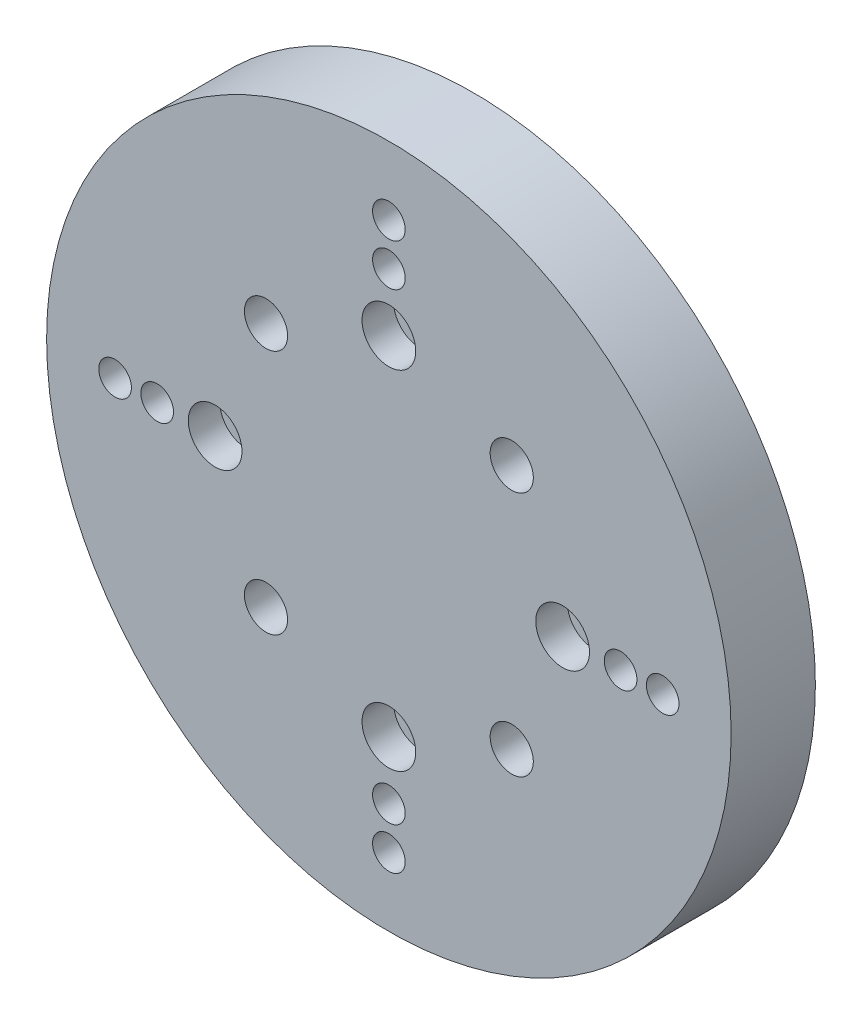
ISO-10303-21;
HEADER;
FILE_DESCRIPTION(('STEP AP214'),'2;1');
FILE_NAME('part.step','',(''),(''),'','','');
FILE_SCHEMA(('AUTOMOTIVE_DESIGN { 1 0 10303 214 1 1 1 1 }'));
ENDSEC;
DATA;
#1=APPLICATION_CONTEXT('core data for automotive mechanical design processes');
#2=APPLICATION_PROTOCOL_DEFINITION('international standard','automotive_design',2000,#1);
#3=PRODUCT_CONTEXT('',#1,'mechanical');
#4=PRODUCT('Part','Part','',(#3));
#5=PRODUCT_RELATED_PRODUCT_CATEGORY('part','',(#4));
#6=PRODUCT_DEFINITION_FORMATION('','',#4);
#7=PRODUCT_DEFINITION_CONTEXT('part definition',#1,'design');
#8=PRODUCT_DEFINITION('design','',#6,#7);
#9=PRODUCT_DEFINITION_SHAPE('','',#8);
#10=(LENGTH_UNIT() NAMED_UNIT(*) SI_UNIT(.MILLI.,.METRE.));
#11=(NAMED_UNIT(*) PLANE_ANGLE_UNIT() SI_UNIT($,.RADIAN.));
#12=(NAMED_UNIT(*) SI_UNIT($,.STERADIAN.) SOLID_ANGLE_UNIT());
#13=UNCERTAINTY_MEASURE_WITH_UNIT(LENGTH_MEASURE(1.E-05),#10,'distance_accuracy_value','');
#14=(GEOMETRIC_REPRESENTATION_CONTEXT(3) GLOBAL_UNCERTAINTY_ASSIGNED_CONTEXT((#13)) GLOBAL_UNIT_ASSIGNED_CONTEXT((#10,
#11,#12)) REPRESENTATION_CONTEXT('',''));
#15=CARTESIAN_POINT('',(0.,0.,0.));
#16=DIRECTION('',(0.,0.,1.));
#17=DIRECTION('',(1.,0.,0.));
#18=AXIS2_PLACEMENT_3D('',#15,#16,#17);
#19=CARTESIAN_POINT('',(0.,0.,34.));
#20=DIRECTION('',(0.,0.,-1.));
#21=DIRECTION('',(-1.,0.,0.));
#22=AXIS2_PLACEMENT_3D('',#19,#20,#21);
#23=CYLINDRICAL_SURFACE('',#22,32.5);
#24=CARTESIAN_POINT('',(0.,0.,34.));
#25=DIRECTION('',(0.,0.,1.));
#26=DIRECTION('',(1.,0.,0.));
#27=AXIS2_PLACEMENT_3D('',#24,#25,#26);
#28=CIRCLE('',#27,32.5);
#29=CARTESIAN_POINT('',(32.5,0.,34.));
#30=VERTEX_POINT('',#29);
#31=EDGE_CURVE('E10',#30,#30,#28,.T.);
#32=ORIENTED_EDGE('',*,*,#31,.F.);
#33=EDGE_LOOP('',(#32));
#34=FACE_BOUND('',#33,.T.);
#35=CARTESIAN_POINT('',(0.,0.,26.));
#36=DIRECTION('',(0.,0.,1.));
#37=DIRECTION('',(1.,0.,0.));
#38=AXIS2_PLACEMENT_3D('',#35,#36,#37);
#39=CIRCLE('',#38,32.5);
#40=CARTESIAN_POINT('',(32.5,0.,26.));
#41=VERTEX_POINT('',#40);
#42=EDGE_CURVE('E129',#41,#41,#39,.T.);
#43=ORIENTED_EDGE('',*,*,#42,.T.);
#44=EDGE_LOOP('',(#43));
#45=FACE_BOUND('',#44,.T.);
#46=ADVANCED_FACE('F36',(#34,#45),#23,.T.);
#47=CARTESIAN_POINT('',(0.,0.,34.));
#48=DIRECTION('',(0.,0.,1.));
#49=DIRECTION('',(1.,0.,0.));
#50=AXIS2_PLACEMENT_3D('',#47,#48,#49);
#51=PLANE('',#50);
#52=CARTESIAN_POINT('',(11.6672618895781,11.667261889578,34.));
#53=DIRECTION('',(0.,0.,1.));
#54=DIRECTION('',(1.,0.,0.));
#55=AXIS2_PLACEMENT_3D('',#52,#53,#54);
#56=CIRCLE('',#55,2.05);
#57=CARTESIAN_POINT('',(13.7172618895781,11.667261889578,34.));
#58=VERTEX_POINT('',#57);
#59=EDGE_CURVE('E77',#58,#58,#56,.T.);
#60=ORIENTED_EDGE('',*,*,#59,.F.);
#61=EDGE_LOOP('',(#60));
#62=FACE_BOUND('',#61,.T.);
#63=CARTESIAN_POINT('',(11.6672618895779,-11.6672618895781,34.));
#64=DIRECTION('',(0.,0.,1.));
#65=DIRECTION('',(1.,0.,0.));
#66=AXIS2_PLACEMENT_3D('',#63,#64,#65);
#67=CIRCLE('',#66,2.05);
#68=CARTESIAN_POINT('',(13.7172618895779,-11.6672618895781,34.));
#69=VERTEX_POINT('',#68);
#70=EDGE_CURVE('E84',#69,#69,#67,.T.);
#71=ORIENTED_EDGE('',*,*,#70,.F.);
#72=EDGE_LOOP('',(#71));
#73=FACE_BOUND('',#72,.T.);
#74=CARTESIAN_POINT('',(-11.6672618895757,-11.667261889578,33.9999999999978));
#75=DIRECTION('',(0.,0.,1.));
#76=DIRECTION('',(1.,0.,0.));
#77=AXIS2_PLACEMENT_3D('',#74,#75,#76);
#78=CIRCLE('',#77,2.05000000000018);
#79=CARTESIAN_POINT('',(-9.6172618895755,-11.667261889578,33.9999999999978));
#80=VERTEX_POINT('',#79);
#81=EDGE_CURVE('E90',#80,#80,#78,.T.);
#82=ORIENTED_EDGE('',*,*,#81,.F.);
#83=EDGE_LOOP('',(#82));
#84=FACE_BOUND('',#83,.T.);
#85=CARTESIAN_POINT('',(0.,22.,34.));
#86=DIRECTION('',(0.,0.,1.));
#87=DIRECTION('',(1.,0.,0.));
#88=AXIS2_PLACEMENT_3D('',#85,#86,#87);
#89=CIRCLE('',#88,1.55);
#90=CARTESIAN_POINT('',(1.55,22.,34.));
#91=VERTEX_POINT('',#90);
#92=EDGE_CURVE('E96',#91,#91,#89,.T.);
#93=ORIENTED_EDGE('',*,*,#92,.F.);
#94=EDGE_LOOP('',(#93));
#95=FACE_BOUND('',#94,.T.);
#96=CARTESIAN_POINT('',(0.,26.,34.));
#97=DIRECTION('',(0.,0.,1.));
#98=DIRECTION('',(1.,0.,0.));
#99=AXIS2_PLACEMENT_3D('',#96,#97,#98);
#100=CIRCLE('',#99,1.55);
#101=CARTESIAN_POINT('',(1.55,26.,34.));
#102=VERTEX_POINT('',#101);
#103=EDGE_CURVE('E53',#102,#102,#100,.T.);
#104=ORIENTED_EDGE('',*,*,#103,.F.);
#105=EDGE_LOOP('',(#104));
#106=FACE_BOUND('',#105,.T.);
#107=CARTESIAN_POINT('',(0.,16.5,34.));
#108=DIRECTION('',(0.,0.,1.));
#109=DIRECTION('',(1.,0.,0.));
#110=AXIS2_PLACEMENT_3D('',#107,#108,#109);
#111=CIRCLE('',#110,2.55);
#112=CARTESIAN_POINT('',(2.55,16.5,34.));
#113=VERTEX_POINT('',#112);
#114=EDGE_CURVE('E60',#113,#113,#111,.T.);
#115=ORIENTED_EDGE('',*,*,#114,.F.);
#116=EDGE_LOOP('',(#115));
#117=FACE_BOUND('',#116,.T.);
#118=CARTESIAN_POINT('',(16.500000000008,0.,33.9999999999921));
#119=DIRECTION('',(0.,0.,1.));
#120=DIRECTION('',(1.,0.,0.));
#121=AXIS2_PLACEMENT_3D('',#118,#119,#120);
#122=CIRCLE('',#121,2.55000000000006);
#123=CARTESIAN_POINT('',(19.050000000008,0.,33.9999999999921));
#124=VERTEX_POINT('',#123);
#125=EDGE_CURVE('E66',#124,#124,#122,.T.);
#126=ORIENTED_EDGE('',*,*,#125,.F.);
#127=EDGE_LOOP('',(#126));
#128=FACE_BOUND('',#127,.T.);
#129=CARTESIAN_POINT('',(0.,-16.5,34.));
#130=DIRECTION('',(0.,0.,1.));
#131=DIRECTION('',(1.,0.,0.));
#132=AXIS2_PLACEMENT_3D('',#129,#130,#131);
#133=CIRCLE('',#132,2.55000000000012);
#134=CARTESIAN_POINT('',(2.55000000000012,-16.5,34.));
#135=VERTEX_POINT('',#134);
#136=EDGE_CURVE('E72',#135,#135,#133,.T.);
#137=ORIENTED_EDGE('',*,*,#136,.F.);
#138=EDGE_LOOP('',(#137));
#139=FACE_BOUND('',#138,.T.);
#140=CARTESIAN_POINT('',(26.0000000000079,0.,33.9999999999923));
#141=DIRECTION('',(0.,0.,1.));
#142=DIRECTION('',(1.,0.,0.));
#143=AXIS2_PLACEMENT_3D('',#140,#141,#142);
#144=CIRCLE('',#143,1.55000000000009);
#145=CARTESIAN_POINT('',(27.550000000008,0.,33.9999999999923));
#146=VERTEX_POINT('',#145);
#147=EDGE_CURVE('E125',#146,#146,#144,.T.);
#148=ORIENTED_EDGE('',*,*,#147,.F.);
#149=EDGE_LOOP('',(#148));
#150=FACE_BOUND('',#149,.T.);
#151=CARTESIAN_POINT('',(22.0000000000079,0.,33.9999999999923));
#152=DIRECTION('',(0.,0.,1.));
#153=DIRECTION('',(1.,0.,0.));
#154=AXIS2_PLACEMENT_3D('',#151,#152,#153);
#155=CIRCLE('',#154,1.55000000000008);
#156=CARTESIAN_POINT('',(23.550000000008,0.,33.9999999999923));
#157=VERTEX_POINT('',#156);
#158=EDGE_CURVE('E132',#157,#157,#155,.T.);
#159=ORIENTED_EDGE('',*,*,#158,.F.);
#160=EDGE_LOOP('',(#159));
#161=FACE_BOUND('',#160,.T.);
#162=CARTESIAN_POINT('',(0.,-26.,34.));
#163=DIRECTION('',(0.,0.,1.));
#164=DIRECTION('',(1.,0.,0.));
#165=AXIS2_PLACEMENT_3D('',#162,#163,#164);
#166=CIRCLE('',#165,1.55000000000018);
#167=CARTESIAN_POINT('',(1.55000000000018,-26.,34.));
#168=VERTEX_POINT('',#167);
#169=EDGE_CURVE('E138',#168,#168,#166,.T.);
#170=ORIENTED_EDGE('',*,*,#169,.F.);
#171=EDGE_LOOP('',(#170));
#172=FACE_BOUND('',#171,.T.);
#173=CARTESIAN_POINT('',(-11.6672618895777,11.6672618895781,33.9999999999998));
#174=DIRECTION('',(0.,0.,1.));
#175=DIRECTION('',(1.,0.,0.));
#176=AXIS2_PLACEMENT_3D('',#173,#174,#175);
#177=CIRCLE('',#176,2.05);
#178=CARTESIAN_POINT('',(-9.61726188957767,11.6672618895781,33.9999999999998));
#179=VERTEX_POINT('',#178);
#180=EDGE_CURVE('E108',#179,#179,#177,.T.);
#181=ORIENTED_EDGE('',*,*,#180,.F.);
#182=EDGE_LOOP('',(#181));
#183=FACE_BOUND('',#182,.T.);
#184=CARTESIAN_POINT('',(-22.,0.,34.));
#185=DIRECTION('',(0.,0.,1.));
#186=DIRECTION('',(1.,0.,0.));
#187=AXIS2_PLACEMENT_3D('',#184,#185,#186);
#188=CIRCLE('',#187,1.55000000000022);
#189=CARTESIAN_POINT('',(-20.4499999999998,0.,34.));
#190=VERTEX_POINT('',#189);
#191=EDGE_CURVE('E101',#190,#190,#188,.T.);
#192=ORIENTED_EDGE('',*,*,#191,.F.);
#193=EDGE_LOOP('',(#192));
#194=FACE_BOUND('',#193,.T.);
#195=CARTESIAN_POINT('',(-26.,0.,34.));
#196=DIRECTION('',(0.,0.,1.));
#197=DIRECTION('',(1.,0.,0.));
#198=AXIS2_PLACEMENT_3D('',#195,#196,#197);
#199=CIRCLE('',#198,1.55000000000026);
#200=CARTESIAN_POINT('',(-24.4499999999998,0.,34.));
#201=VERTEX_POINT('',#200);
#202=EDGE_CURVE('E120',#201,#201,#199,.T.);
#203=ORIENTED_EDGE('',*,*,#202,.F.);
#204=EDGE_LOOP('',(#203));
#205=FACE_BOUND('',#204,.T.);
#206=CARTESIAN_POINT('',(0.,-22.,34.));
#207=DIRECTION('',(0.,0.,1.));
#208=DIRECTION('',(1.,0.,0.));
#209=AXIS2_PLACEMENT_3D('',#206,#207,#208);
#210=CIRCLE('',#209,1.55000000000015);
#211=CARTESIAN_POINT('',(1.55000000000015,-22.,34.));
#212=VERTEX_POINT('',#211);
#213=EDGE_CURVE('E113',#212,#212,#210,.T.);
#214=ORIENTED_EDGE('',*,*,#213,.F.);
#215=EDGE_LOOP('',(#214));
#216=FACE_BOUND('',#215,.T.);
#217=CARTESIAN_POINT('',(-16.5,0.,34.));
#218=DIRECTION('',(0.,0.,1.));
#219=DIRECTION('',(1.,0.,0.));
#220=AXIS2_PLACEMENT_3D('',#217,#218,#219);
#221=CIRCLE('',#220,2.55000000000017);
#222=CARTESIAN_POINT('',(-13.9499999999998,0.,34.));
#223=VERTEX_POINT('',#222);
#224=EDGE_CURVE('E46',#223,#223,#221,.T.);
#225=ORIENTED_EDGE('',*,*,#224,.F.);
#226=EDGE_LOOP('',(#225));
#227=FACE_BOUND('',#226,.T.);
#228=ORIENTED_EDGE('',*,*,#31,.T.);
#229=EDGE_LOOP('',(#228));
#230=FACE_BOUND('',#229,.T.);
#231=ADVANCED_FACE('F168',(#62,#73,#84,#95,#106,#117,#128,#139,#150,#161,#172,#183,#194,#205,
#216,#227,#230),#51,.T.);
#232=CARTESIAN_POINT('',(-16.4999999999998,0.,31.));
#233=DIRECTION('',(0.,0.,1.));
#234=DIRECTION('',(1.,0.,0.));
#235=AXIS2_PLACEMENT_3D('',#232,#233,#234);
#236=CYLINDRICAL_SURFACE('',#235,2.55000000000017);
#237=CARTESIAN_POINT('',(-16.4999999999998,0.,31.));
#238=DIRECTION('',(0.,0.,1.));
#239=DIRECTION('',(1.,0.,0.));
#240=AXIS2_PLACEMENT_3D('',#237,#238,#239);
#241=CIRCLE('',#240,2.55000000000017);
#242=CARTESIAN_POINT('',(-13.9499999999997,0.,31.));
#243=VERTEX_POINT('',#242);
#244=EDGE_CURVE('E42',#243,#243,#241,.T.);
#245=ORIENTED_EDGE('',*,*,#244,.F.);
#246=EDGE_LOOP('',(#245));
#247=FACE_BOUND('',#246,.T.);
#248=ORIENTED_EDGE('',*,*,#224,.T.);
#249=EDGE_LOOP('',(#248));
#250=FACE_BOUND('',#249,.T.);
#251=ADVANCED_FACE('F173',(#247,#250),#236,.F.);
#252=CARTESIAN_POINT('',(-16.4999999999998,0.,31.));
#253=DIRECTION('',(0.,0.,1.));
#254=DIRECTION('',(1.,0.,0.));
#255=AXIS2_PLACEMENT_3D('',#252,#253,#254);
#256=PLANE('',#255);
#257=ORIENTED_EDGE('',*,*,#244,.T.);
#258=EDGE_LOOP('',(#257));
#259=FACE_BOUND('',#258,.T.);
#260=ADVANCED_FACE('F178',(#259),#256,.T.);
#261=CARTESIAN_POINT('',(1.22124532708767E-12,-22.,30.9999999999987));
#262=DIRECTION('',(0.,0.,1.));
#263=DIRECTION('',(1.,0.,0.));
#264=AXIS2_PLACEMENT_3D('',#261,#262,#263);
#265=CYLINDRICAL_SURFACE('',#264,1.55000000000015);
#266=CARTESIAN_POINT('',(1.22124532708767E-12,-22.,30.9999999999987));
#267=DIRECTION('',(0.,0.,1.));
#268=DIRECTION('',(1.,0.,0.));
#269=AXIS2_PLACEMENT_3D('',#266,#267,#268);
#270=CIRCLE('',#269,1.55000000000015);
#271=CARTESIAN_POINT('',(1.55000000000137,-22.,30.9999999999987));
#272=VERTEX_POINT('',#271);
#273=EDGE_CURVE('E116',#272,#272,#270,.T.);
#274=ORIENTED_EDGE('',*,*,#273,.F.);
#275=EDGE_LOOP('',(#274));
#276=FACE_BOUND('',#275,.T.);
#277=ORIENTED_EDGE('',*,*,#213,.T.);
#278=EDGE_LOOP('',(#277));
#279=FACE_BOUND('',#278,.T.);
#280=ADVANCED_FACE('F186',(#276,#279),#265,.F.);
#281=CARTESIAN_POINT('',(1.22124532708767E-12,-22.,30.9999999999987));
#282=DIRECTION('',(0.,0.,1.));
#283=DIRECTION('',(1.,0.,0.));
#284=AXIS2_PLACEMENT_3D('',#281,#282,#283);
#285=PLANE('',#284);
#286=ORIENTED_EDGE('',*,*,#273,.T.);
#287=EDGE_LOOP('',(#286));
#288=FACE_BOUND('',#287,.T.);
#289=ADVANCED_FACE('F271',(#288),#285,.T.);
#290=CARTESIAN_POINT('',(-25.9999999999997,0.,31.));
#291=DIRECTION('',(0.,0.,1.));
#292=DIRECTION('',(1.,0.,0.));
#293=AXIS2_PLACEMENT_3D('',#290,#291,#292);
#294=CYLINDRICAL_SURFACE('',#293,1.55000000000026);
#295=CARTESIAN_POINT('',(-25.9999999999997,0.,31.));
#296=DIRECTION('',(0.,0.,1.));
#297=DIRECTION('',(1.,0.,0.));
#298=AXIS2_PLACEMENT_3D('',#295,#296,#297);
#299=CIRCLE('',#298,1.55000000000026);
#300=CARTESIAN_POINT('',(-24.4499999999994,0.,31.));
#301=VERTEX_POINT('',#300);
#302=EDGE_CURVE('E105',#301,#301,#299,.T.);
#303=ORIENTED_EDGE('',*,*,#302,.F.);
#304=EDGE_LOOP('',(#303));
#305=FACE_BOUND('',#304,.T.);
#306=ORIENTED_EDGE('',*,*,#202,.T.);
#307=EDGE_LOOP('',(#306));
#308=FACE_BOUND('',#307,.T.);
#309=ADVANCED_FACE('F275',(#305,#308),#294,.F.);
#310=CARTESIAN_POINT('',(-25.9999999999997,0.,31.));
#311=DIRECTION('',(0.,0.,1.));
#312=DIRECTION('',(1.,0.,0.));
#313=AXIS2_PLACEMENT_3D('',#310,#311,#312);
#314=PLANE('',#313);
#315=ORIENTED_EDGE('',*,*,#302,.T.);
#316=EDGE_LOOP('',(#315));
#317=FACE_BOUND('',#316,.T.);
#318=ADVANCED_FACE('F255',(#317),#314,.T.);
#319=CARTESIAN_POINT('',(-21.9999999999995,0.,30.9999999999998));
#320=DIRECTION('',(0.,0.,1.));
#321=DIRECTION('',(1.,0.,0.));
#322=AXIS2_PLACEMENT_3D('',#319,#320,#321);
#323=CYLINDRICAL_SURFACE('',#322,1.55000000000022);
#324=CARTESIAN_POINT('',(-21.9999999999995,0.,30.9999999999998));
#325=DIRECTION('',(0.,0.,1.));
#326=DIRECTION('',(1.,0.,0.));
#327=AXIS2_PLACEMENT_3D('',#324,#325,#326);
#328=CIRCLE('',#327,1.55000000000022);
#329=CARTESIAN_POINT('',(-20.4499999999992,0.,30.9999999999998));
#330=VERTEX_POINT('',#329);
#331=EDGE_CURVE('E104',#330,#330,#328,.T.);
#332=ORIENTED_EDGE('',*,*,#331,.F.);
#333=EDGE_LOOP('',(#332));
#334=FACE_BOUND('',#333,.T.);
#335=ORIENTED_EDGE('',*,*,#191,.T.);
#336=EDGE_LOOP('',(#335));
#337=FACE_BOUND('',#336,.T.);
#338=ADVANCED_FACE('F251',(#334,#337),#323,.F.);
#339=CARTESIAN_POINT('',(-21.9999999999995,0.,30.9999999999998));
#340=DIRECTION('',(0.,0.,1.));
#341=DIRECTION('',(1.,0.,0.));
#342=AXIS2_PLACEMENT_3D('',#339,#340,#341);
#343=PLANE('',#342);
#344=ORIENTED_EDGE('',*,*,#331,.T.);
#345=EDGE_LOOP('',(#344));
#346=FACE_BOUND('',#345,.T.);
#347=ADVANCED_FACE('F254',(#346),#343,.T.);
#348=CARTESIAN_POINT('',(-11.667261889578,11.6672618895781,31.));
#349=DIRECTION('',(0.,0.,1.));
#350=DIRECTION('',(1.,0.,0.));
#351=AXIS2_PLACEMENT_3D('',#348,#349,#350);
#352=CYLINDRICAL_SURFACE('',#351,2.05);
#353=CARTESIAN_POINT('',(-11.667261889578,11.6672618895781,31.));
#354=DIRECTION('',(0.,0.,1.));
#355=DIRECTION('',(1.,0.,0.));
#356=AXIS2_PLACEMENT_3D('',#353,#354,#355);
#357=CIRCLE('',#356,2.05);
#358=CARTESIAN_POINT('',(-9.61726188957801,11.6672618895781,31.));
#359=VERTEX_POINT('',#358);
#360=EDGE_CURVE('E81',#359,#359,#357,.T.);
#361=ORIENTED_EDGE('',*,*,#360,.F.);
#362=EDGE_LOOP('',(#361));
#363=FACE_BOUND('',#362,.T.);
#364=ORIENTED_EDGE('',*,*,#180,.T.);
#365=EDGE_LOOP('',(#364));
#366=FACE_BOUND('',#365,.T.);
#367=ADVANCED_FACE('F259',(#363,#366),#352,.F.);
#368=CARTESIAN_POINT('',(-11.667261889578,11.6672618895781,31.));
#369=DIRECTION('',(0.,0.,1.));
#370=DIRECTION('',(1.,0.,0.));
#371=AXIS2_PLACEMENT_3D('',#368,#369,#370);
#372=PLANE('',#371);
#373=ORIENTED_EDGE('',*,*,#360,.T.);
#374=EDGE_LOOP('',(#373));
#375=FACE_BOUND('',#374,.T.);
#376=ADVANCED_FACE('F263',(#375),#372,.T.);
#377=CARTESIAN_POINT('',(1.22124532708767E-12,-26.,30.9999999999987));
#378=DIRECTION('',(0.,0.,1.));
#379=DIRECTION('',(1.,0.,0.));
#380=AXIS2_PLACEMENT_3D('',#377,#378,#379);
#381=CYLINDRICAL_SURFACE('',#380,1.55000000000018);
#382=CARTESIAN_POINT('',(1.22124532708767E-12,-26.,30.9999999999987));
#383=DIRECTION('',(0.,0.,1.));
#384=DIRECTION('',(1.,0.,0.));
#385=AXIS2_PLACEMENT_3D('',#382,#383,#384);
#386=CIRCLE('',#385,1.55000000000018);
#387=CARTESIAN_POINT('',(1.5500000000014,-26.,30.9999999999987));
#388=VERTEX_POINT('',#387);
#389=EDGE_CURVE('E117',#388,#388,#386,.T.);
#390=ORIENTED_EDGE('',*,*,#389,.F.);
#391=EDGE_LOOP('',(#390));
#392=FACE_BOUND('',#391,.T.);
#393=ORIENTED_EDGE('',*,*,#169,.T.);
#394=EDGE_LOOP('',(#393));
#395=FACE_BOUND('',#394,.T.);
#396=ADVANCED_FACE('F267',(#392,#395),#381,.F.);
#397=CARTESIAN_POINT('',(1.22124532708767E-12,-26.,30.9999999999987));
#398=DIRECTION('',(0.,0.,1.));
#399=DIRECTION('',(1.,0.,0.));
#400=AXIS2_PLACEMENT_3D('',#397,#398,#399);
#401=PLANE('',#400);
#402=ORIENTED_EDGE('',*,*,#389,.T.);
#403=EDGE_LOOP('',(#402));
#404=FACE_BOUND('',#403,.T.);
#405=ADVANCED_FACE('F294',(#404),#401,.T.);
#406=CARTESIAN_POINT('',(22.000000000008,0.,30.999999999992));
#407=DIRECTION('',(0.,0.,1.));
#408=DIRECTION('',(1.,0.,0.));
#409=AXIS2_PLACEMENT_3D('',#406,#407,#408);
#410=CYLINDRICAL_SURFACE('',#409,1.55000000000008);
#411=CARTESIAN_POINT('',(22.000000000008,0.,30.999999999992));
#412=DIRECTION('',(0.,0.,1.));
#413=DIRECTION('',(1.,0.,0.));
#414=AXIS2_PLACEMENT_3D('',#411,#412,#413);
#415=CIRCLE('',#414,1.55000000000008);
#416=CARTESIAN_POINT('',(23.5500000000081,0.,30.999999999992));
#417=VERTEX_POINT('',#416);
#418=EDGE_CURVE('E135',#417,#417,#415,.T.);
#419=ORIENTED_EDGE('',*,*,#418,.F.);
#420=EDGE_LOOP('',(#419));
#421=FACE_BOUND('',#420,.T.);
#422=ORIENTED_EDGE('',*,*,#158,.T.);
#423=EDGE_LOOP('',(#422));
#424=FACE_BOUND('',#423,.T.);
#425=ADVANCED_FACE('F291',(#421,#424),#410,.F.);
#426=CARTESIAN_POINT('',(22.000000000008,0.,30.999999999992));
#427=DIRECTION('',(0.,0.,1.));
#428=DIRECTION('',(1.,0.,0.));
#429=AXIS2_PLACEMENT_3D('',#426,#427,#428);
#430=PLANE('',#429);
#431=ORIENTED_EDGE('',*,*,#418,.T.);
#432=EDGE_LOOP('',(#431));
#433=FACE_BOUND('',#432,.T.);
#434=ADVANCED_FACE('F286',(#433),#430,.T.);
#435=CARTESIAN_POINT('',(26.000000000008,0.,30.999999999992));
#436=DIRECTION('',(0.,0.,1.));
#437=DIRECTION('',(1.,0.,0.));
#438=AXIS2_PLACEMENT_3D('',#435,#436,#437);
#439=CYLINDRICAL_SURFACE('',#438,1.55000000000009);
#440=CARTESIAN_POINT('',(26.000000000008,0.,30.999999999992));
#441=DIRECTION('',(0.,0.,1.));
#442=DIRECTION('',(1.,0.,0.));
#443=AXIS2_PLACEMENT_3D('',#440,#441,#442);
#444=CIRCLE('',#443,1.55000000000009);
#445=CARTESIAN_POINT('',(27.5500000000081,0.,30.999999999992));
#446=VERTEX_POINT('',#445);
#447=EDGE_CURVE('E128',#446,#446,#444,.T.);
#448=ORIENTED_EDGE('',*,*,#447,.F.);
#449=EDGE_LOOP('',(#448));
#450=FACE_BOUND('',#449,.T.);
#451=ORIENTED_EDGE('',*,*,#147,.T.);
#452=EDGE_LOOP('',(#451));
#453=FACE_BOUND('',#452,.T.);
#454=ADVANCED_FACE('F283',(#450,#453),#439,.F.);
#455=CARTESIAN_POINT('',(26.000000000008,0.,30.999999999992));
#456=DIRECTION('',(0.,0.,1.));
#457=DIRECTION('',(1.,0.,0.));
#458=AXIS2_PLACEMENT_3D('',#455,#456,#457);
#459=PLANE('',#458);
#460=ORIENTED_EDGE('',*,*,#447,.T.);
#461=EDGE_LOOP('',(#460));
#462=FACE_BOUND('',#461,.T.);
#463=ADVANCED_FACE('F216',(#462),#459,.T.);
#464=CARTESIAN_POINT('',(3.66373598126302E-12,-16.5,30.9999999999963));
#465=DIRECTION('',(0.,0.,1.));
#466=DIRECTION('',(1.,0.,0.));
#467=AXIS2_PLACEMENT_3D('',#464,#465,#466);
#468=CYLINDRICAL_SURFACE('',#467,2.55000000000012);
#469=CARTESIAN_POINT('',(3.66373598126302E-12,-16.5,30.9999999999963));
#470=DIRECTION('',(0.,0.,1.));
#471=DIRECTION('',(1.,0.,0.));
#472=AXIS2_PLACEMENT_3D('',#469,#470,#471);
#473=CIRCLE('',#472,2.55000000000012);
#474=CARTESIAN_POINT('',(2.55000000000378,-16.5,30.9999999999963));
#475=VERTEX_POINT('',#474);
#476=EDGE_CURVE('E51',#475,#475,#473,.T.);
#477=ORIENTED_EDGE('',*,*,#476,.F.);
#478=EDGE_LOOP('',(#477));
#479=FACE_BOUND('',#478,.T.);
#480=ORIENTED_EDGE('',*,*,#136,.T.);
#481=EDGE_LOOP('',(#480));
#482=FACE_BOUND('',#481,.T.);
#483=ADVANCED_FACE('F213',(#479,#482),#468,.F.);
#484=CARTESIAN_POINT('',(3.66373598126302E-12,-16.5,30.9999999999963));
#485=DIRECTION('',(0.,0.,1.));
#486=DIRECTION('',(1.,0.,0.));
#487=AXIS2_PLACEMENT_3D('',#484,#485,#486);
#488=PLANE('',#487);
#489=ORIENTED_EDGE('',*,*,#476,.T.);
#490=EDGE_LOOP('',(#489));
#491=FACE_BOUND('',#490,.T.);
#492=ADVANCED_FACE('F208',(#491),#488,.T.);
#493=CARTESIAN_POINT('',(16.500000000008,0.,30.999999999992));
#494=DIRECTION('',(0.,0.,1.));
#495=DIRECTION('',(1.,0.,0.));
#496=AXIS2_PLACEMENT_3D('',#493,#494,#495);
#497=CYLINDRICAL_SURFACE('',#496,2.55000000000006);
#498=CARTESIAN_POINT('',(16.500000000008,0.,30.999999999992));
#499=DIRECTION('',(0.,0.,1.));
#500=DIRECTION('',(1.,0.,0.));
#501=AXIS2_PLACEMENT_3D('',#498,#499,#500);
#502=CIRCLE('',#501,2.55000000000006);
#503=CARTESIAN_POINT('',(19.050000000008,0.,30.999999999992));
#504=VERTEX_POINT('',#503);
#505=EDGE_CURVE('E69',#504,#504,#502,.T.);
#506=ORIENTED_EDGE('',*,*,#505,.F.);
#507=EDGE_LOOP('',(#506));
#508=FACE_BOUND('',#507,.T.);
#509=ORIENTED_EDGE('',*,*,#125,.T.);
#510=EDGE_LOOP('',(#509));
#511=FACE_BOUND('',#510,.T.);
#512=ADVANCED_FACE('F205',(#508,#511),#497,.F.);
#513=CARTESIAN_POINT('',(16.500000000008,0.,30.999999999992));
#514=DIRECTION('',(0.,0.,1.));
#515=DIRECTION('',(1.,0.,0.));
#516=AXIS2_PLACEMENT_3D('',#513,#514,#515);
#517=PLANE('',#516);
#518=ORIENTED_EDGE('',*,*,#505,.T.);
#519=EDGE_LOOP('',(#518));
#520=FACE_BOUND('',#519,.T.);
#521=ADVANCED_FACE('F200',(#520),#517,.T.);
#522=CARTESIAN_POINT('',(5.44009282066327E-12,16.5,30.9999999999945));
#523=DIRECTION('',(0.,0.,1.));
#524=DIRECTION('',(1.,0.,0.));
#525=AXIS2_PLACEMENT_3D('',#522,#523,#524);
#526=CYLINDRICAL_SURFACE('',#525,2.55);
#527=CARTESIAN_POINT('',(5.44009282066327E-12,16.5,30.9999999999945));
#528=DIRECTION('',(0.,0.,1.));
#529=DIRECTION('',(1.,0.,0.));
#530=AXIS2_PLACEMENT_3D('',#527,#528,#529);
#531=CIRCLE('',#530,2.55);
#532=CARTESIAN_POINT('',(2.55000000000544,16.5,30.9999999999945));
#533=VERTEX_POINT('',#532);
#534=EDGE_CURVE('E63',#533,#533,#531,.T.);
#535=ORIENTED_EDGE('',*,*,#534,.F.);
#536=EDGE_LOOP('',(#535));
#537=FACE_BOUND('',#536,.T.);
#538=ORIENTED_EDGE('',*,*,#114,.T.);
#539=EDGE_LOOP('',(#538));
#540=FACE_BOUND('',#539,.T.);
#541=ADVANCED_FACE('F197',(#537,#540),#526,.F.);
#542=CARTESIAN_POINT('',(5.44009282066327E-12,16.5,30.9999999999945));
#543=DIRECTION('',(0.,0.,1.));
#544=DIRECTION('',(1.,0.,0.));
#545=AXIS2_PLACEMENT_3D('',#542,#543,#544);
#546=PLANE('',#545);
#547=ORIENTED_EDGE('',*,*,#534,.T.);
#548=EDGE_LOOP('',(#547));
#549=FACE_BOUND('',#548,.T.);
#550=ADVANCED_FACE('F191',(#549),#546,.T.);
#551=CARTESIAN_POINT('',(5.44009282066327E-12,26.,30.9999999999945));
#552=DIRECTION('',(0.,0.,1.));
#553=DIRECTION('',(1.,0.,0.));
#554=AXIS2_PLACEMENT_3D('',#551,#552,#553);
#555=CYLINDRICAL_SURFACE('',#554,1.55);
#556=CARTESIAN_POINT('',(5.44009282066327E-12,26.,30.9999999999945));
#557=DIRECTION('',(0.,0.,1.));
#558=DIRECTION('',(1.,0.,0.));
#559=AXIS2_PLACEMENT_3D('',#556,#557,#558);
#560=CIRCLE('',#559,1.55);
#561=CARTESIAN_POINT('',(1.55000000000544,26.,30.9999999999945));
#562=VERTEX_POINT('',#561);
#563=EDGE_CURVE('E56',#562,#562,#560,.T.);
#564=ORIENTED_EDGE('',*,*,#563,.F.);
#565=EDGE_LOOP('',(#564));
#566=FACE_BOUND('',#565,.T.);
#567=ORIENTED_EDGE('',*,*,#103,.T.);
#568=EDGE_LOOP('',(#567));
#569=FACE_BOUND('',#568,.T.);
#570=ADVANCED_FACE('F187',(#566,#569),#555,.F.);
#571=CARTESIAN_POINT('',(5.44009282066327E-12,26.,30.9999999999945));
#572=DIRECTION('',(0.,0.,1.));
#573=DIRECTION('',(1.,0.,0.));
#574=AXIS2_PLACEMENT_3D('',#571,#572,#573);
#575=PLANE('',#574);
#576=ORIENTED_EDGE('',*,*,#563,.T.);
#577=EDGE_LOOP('',(#576));
#578=FACE_BOUND('',#577,.T.);
#579=ADVANCED_FACE('F190',(#578),#575,.T.);
#580=CARTESIAN_POINT('',(5.44009282066327E-12,22.,30.9999999999945));
#581=DIRECTION('',(0.,0.,1.));
#582=DIRECTION('',(1.,0.,0.));
#583=AXIS2_PLACEMENT_3D('',#580,#581,#582);
#584=CYLINDRICAL_SURFACE('',#583,1.55);
#585=CARTESIAN_POINT('',(5.44009282066327E-12,22.,30.9999999999945));
#586=DIRECTION('',(0.,0.,1.));
#587=DIRECTION('',(1.,0.,0.));
#588=AXIS2_PLACEMENT_3D('',#585,#586,#587);
#589=CIRCLE('',#588,1.55);
#590=CARTESIAN_POINT('',(1.55000000000544,22.,30.9999999999945));
#591=VERTEX_POINT('',#590);
#592=EDGE_CURVE('E57',#591,#591,#589,.T.);
#593=ORIENTED_EDGE('',*,*,#592,.F.);
#594=EDGE_LOOP('',(#593));
#595=FACE_BOUND('',#594,.T.);
#596=ORIENTED_EDGE('',*,*,#92,.T.);
#597=EDGE_LOOP('',(#596));
#598=FACE_BOUND('',#597,.T.);
#599=ADVANCED_FACE('F195',(#595,#598),#584,.F.);
#600=CARTESIAN_POINT('',(5.44009282066327E-12,22.,30.9999999999945));
#601=DIRECTION('',(0.,0.,1.));
#602=DIRECTION('',(1.,0.,0.));
#603=AXIS2_PLACEMENT_3D('',#600,#601,#602);
#604=PLANE('',#603);
#605=ORIENTED_EDGE('',*,*,#592,.T.);
#606=EDGE_LOOP('',(#605));
#607=FACE_BOUND('',#606,.T.);
#608=ADVANCED_FACE('F240',(#607),#604,.T.);
#609=CARTESIAN_POINT('',(-11.667261889578,-11.667261889578,31.));
#610=DIRECTION('',(0.,0.,1.));
#611=DIRECTION('',(1.,0.,0.));
#612=AXIS2_PLACEMENT_3D('',#609,#610,#611);
#613=CYLINDRICAL_SURFACE('',#612,2.05000000000018);
#614=CARTESIAN_POINT('',(-11.667261889578,-11.667261889578,31.));
#615=DIRECTION('',(0.,0.,1.));
#616=DIRECTION('',(1.,0.,0.));
#617=AXIS2_PLACEMENT_3D('',#614,#615,#616);
#618=CIRCLE('',#617,2.05000000000018);
#619=CARTESIAN_POINT('',(-9.61726188957783,-11.667261889578,31.));
#620=VERTEX_POINT('',#619);
#621=EDGE_CURVE('E93',#620,#620,#618,.T.);
#622=ORIENTED_EDGE('',*,*,#621,.F.);
#623=EDGE_LOOP('',(#622));
#624=FACE_BOUND('',#623,.T.);
#625=ORIENTED_EDGE('',*,*,#81,.T.);
#626=EDGE_LOOP('',(#625));
#627=FACE_BOUND('',#626,.T.);
#628=ADVANCED_FACE('F237',(#624,#627),#613,.F.);
#629=CARTESIAN_POINT('',(-11.667261889578,-11.667261889578,31.));
#630=DIRECTION('',(0.,0.,1.));
#631=DIRECTION('',(1.,0.,0.));
#632=AXIS2_PLACEMENT_3D('',#629,#630,#631);
#633=PLANE('',#632);
#634=ORIENTED_EDGE('',*,*,#621,.T.);
#635=EDGE_LOOP('',(#634));
#636=FACE_BOUND('',#635,.T.);
#637=ADVANCED_FACE('F232',(#636),#633,.T.);
#638=CARTESIAN_POINT('',(11.6672618895859,-11.6672618895781,30.999999999992));
#639=DIRECTION('',(0.,0.,1.));
#640=DIRECTION('',(1.,0.,0.));
#641=AXIS2_PLACEMENT_3D('',#638,#639,#640);
#642=CYLINDRICAL_SURFACE('',#641,2.05);
#643=CARTESIAN_POINT('',(11.6672618895859,-11.6672618895781,30.999999999992));
#644=DIRECTION('',(0.,0.,1.));
#645=DIRECTION('',(1.,0.,0.));
#646=AXIS2_PLACEMENT_3D('',#643,#644,#645);
#647=CIRCLE('',#646,2.05);
#648=CARTESIAN_POINT('',(13.7172618895859,-11.6672618895781,30.999999999992));
#649=VERTEX_POINT('',#648);
#650=EDGE_CURVE('E87',#649,#649,#647,.T.);
#651=ORIENTED_EDGE('',*,*,#650,.F.);
#652=EDGE_LOOP('',(#651));
#653=FACE_BOUND('',#652,.T.);
#654=ORIENTED_EDGE('',*,*,#70,.T.);
#655=EDGE_LOOP('',(#654));
#656=FACE_BOUND('',#655,.T.);
#657=ADVANCED_FACE('F229',(#653,#656),#642,.F.);
#658=CARTESIAN_POINT('',(11.6672618895859,-11.6672618895781,30.999999999992));
#659=DIRECTION('',(0.,0.,1.));
#660=DIRECTION('',(1.,0.,0.));
#661=AXIS2_PLACEMENT_3D('',#658,#659,#660);
#662=PLANE('',#661);
#663=ORIENTED_EDGE('',*,*,#650,.T.);
#664=EDGE_LOOP('',(#663));
#665=FACE_BOUND('',#664,.T.);
#666=ADVANCED_FACE('F224',(#665),#662,.T.);
#667=CARTESIAN_POINT('',(11.6672618895859,11.667261889578,30.9999999999925));
#668=DIRECTION('',(0.,0.,1.));
#669=DIRECTION('',(1.,0.,0.));
#670=AXIS2_PLACEMENT_3D('',#667,#668,#669);
#671=CYLINDRICAL_SURFACE('',#670,2.05);
#672=CARTESIAN_POINT('',(11.6672618895859,11.667261889578,30.9999999999925));
#673=DIRECTION('',(0.,0.,1.));
#674=DIRECTION('',(1.,0.,0.));
#675=AXIS2_PLACEMENT_3D('',#672,#673,#674);
#676=CIRCLE('',#675,2.05);
#677=CARTESIAN_POINT('',(13.7172618895859,11.667261889578,30.9999999999925));
#678=VERTEX_POINT('',#677);
#679=EDGE_CURVE('E80',#678,#678,#676,.T.);
#680=ORIENTED_EDGE('',*,*,#679,.F.);
#681=EDGE_LOOP('',(#680));
#682=FACE_BOUND('',#681,.T.);
#683=ORIENTED_EDGE('',*,*,#59,.T.);
#684=EDGE_LOOP('',(#683));
#685=FACE_BOUND('',#684,.T.);
#686=ADVANCED_FACE('F221',(#682,#685),#671,.F.);
#687=CARTESIAN_POINT('',(11.6672618895859,11.667261889578,30.9999999999925));
#688=DIRECTION('',(0.,0.,1.));
#689=DIRECTION('',(1.,0.,0.));
#690=AXIS2_PLACEMENT_3D('',#687,#688,#689);
#691=PLANE('',#690);
#692=ORIENTED_EDGE('',*,*,#679,.T.);
#693=EDGE_LOOP('',(#692));
#694=FACE_BOUND('',#693,.T.);
#695=ADVANCED_FACE('F163',(#694),#691,.T.);
#696=CARTESIAN_POINT('',(0.,0.,26.));
#697=DIRECTION('',(0.,0.,1.));
#698=DIRECTION('',(1.,0.,0.));
#699=AXIS2_PLACEMENT_3D('',#696,#697,#698);
#700=PLANE('',#699);
#701=CARTESIAN_POINT('',(0.,0.,26.));
#702=DIRECTION('',(0.,0.,-1.));
#703=DIRECTION('',(-1.,0.,0.));
#704=AXIS2_PLACEMENT_3D('',#701,#702,#703);
#705=CIRCLE('',#704,10.);
#706=CARTESIAN_POINT('',(-10.,0.,26.));
#707=VERTEX_POINT('',#706);
#708=EDGE_CURVE('E146',#707,#707,#705,.T.);
#709=ORIENTED_EDGE('',*,*,#708,.F.);
#710=EDGE_LOOP('',(#709));
#711=FACE_BOUND('',#710,.T.);
#712=ORIENTED_EDGE('',*,*,#42,.F.);
#713=EDGE_LOOP('',(#712));
#714=FACE_BOUND('',#713,.T.);
#715=ADVANCED_FACE('F157',(#711,#714),#700,.F.);
#716=CARTESIAN_POINT('',(3.66373598126302E-12,0.,30.9999999999963));
#717=DIRECTION('',(0.,0.,-1.));
#718=DIRECTION('',(-1.,0.,0.));
#719=AXIS2_PLACEMENT_3D('',#716,#717,#718);
#720=CYLINDRICAL_SURFACE('',#719,10.);
#721=CARTESIAN_POINT('',(3.66373598126302E-12,0.,30.9999999999963));
#722=DIRECTION('',(0.,0.,-1.));
#723=DIRECTION('',(-1.,0.,0.));
#724=AXIS2_PLACEMENT_3D('',#721,#722,#723);
#725=CIRCLE('',#724,10.);
#726=CARTESIAN_POINT('',(-9.99999999999634,0.,30.9999999999963));
#727=VERTEX_POINT('',#726);
#728=EDGE_CURVE('E145',#727,#727,#725,.T.);
#729=ORIENTED_EDGE('',*,*,#728,.F.);
#730=EDGE_LOOP('',(#729));
#731=FACE_BOUND('',#730,.T.);
#732=ORIENTED_EDGE('',*,*,#708,.T.);
#733=EDGE_LOOP('',(#732));
#734=FACE_BOUND('',#733,.T.);
#735=ADVANCED_FACE('F154',(#731,#734),#720,.F.);
#736=CARTESIAN_POINT('',(3.66373598126302E-12,0.,30.9999999999963));
#737=DIRECTION('',(0.,0.,-1.));
#738=DIRECTION('',(-1.,0.,0.));
#739=AXIS2_PLACEMENT_3D('',#736,#737,#738);
#740=PLANE('',#739);
#741=ORIENTED_EDGE('',*,*,#728,.T.);
#742=EDGE_LOOP('',(#741));
#743=FACE_BOUND('',#742,.T.);
#744=ADVANCED_FACE('F152',(#743),#740,.T.);
#745=CLOSED_SHELL('',(#46,#231,#251,#260,#280,#289,#309,#318,#338,#347,#367,#376,#396,#405,#425,
#434,#454,#463,#483,#492,#512,#521,#541,#550,#570,#579,#599,#608,#628,#637,#657,#666,#686,#695,
#715,#735,#744));
#746=MANIFOLD_SOLID_BREP('B2',#745);
#747=ADVANCED_BREP_SHAPE_REPRESENTATION('',(#18,#746),#14);
#748=SHAPE_DEFINITION_REPRESENTATION(#9,#747);
ENDSEC;
END-ISO-10303-21;
